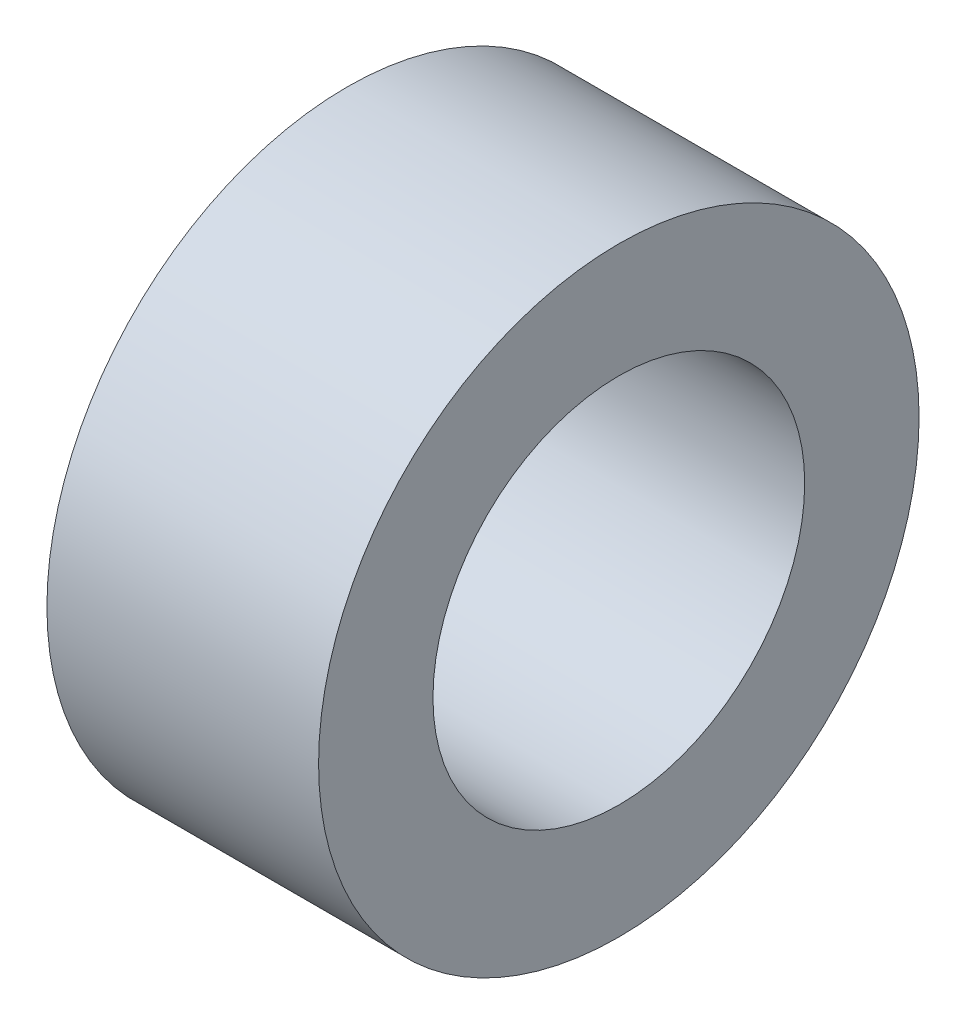
ISO-10303-21;
HEADER;
FILE_DESCRIPTION(('STEP AP214'),'2;1');
FILE_NAME('part.step','',(''),(''),'','','');
FILE_SCHEMA(('AUTOMOTIVE_DESIGN { 1 0 10303 214 1 1 1 1 }'));
ENDSEC;
DATA;
#1=APPLICATION_CONTEXT('core data for automotive mechanical design processes');
#2=APPLICATION_PROTOCOL_DEFINITION('international standard','automotive_design',2000,#1);
#3=PRODUCT_CONTEXT('',#1,'mechanical');
#4=PRODUCT('Part','Part','',(#3));
#5=PRODUCT_RELATED_PRODUCT_CATEGORY('part','',(#4));
#6=PRODUCT_DEFINITION_FORMATION('','',#4);
#7=PRODUCT_DEFINITION_CONTEXT('part definition',#1,'design');
#8=PRODUCT_DEFINITION('design','',#6,#7);
#9=PRODUCT_DEFINITION_SHAPE('','',#8);
#10=(LENGTH_UNIT() NAMED_UNIT(*) SI_UNIT(.MILLI.,.METRE.));
#11=(NAMED_UNIT(*) PLANE_ANGLE_UNIT() SI_UNIT($,.RADIAN.));
#12=(NAMED_UNIT(*) SI_UNIT($,.STERADIAN.) SOLID_ANGLE_UNIT());
#13=UNCERTAINTY_MEASURE_WITH_UNIT(LENGTH_MEASURE(1.E-05),#10,'distance_accuracy_value','');
#14=(GEOMETRIC_REPRESENTATION_CONTEXT(3) GLOBAL_UNCERTAINTY_ASSIGNED_CONTEXT((#13)) GLOBAL_UNIT_ASSIGNED_CONTEXT((#10,
#11,#12)) REPRESENTATION_CONTEXT('',''));
#15=CARTESIAN_POINT('',(0.,0.,0.));
#16=DIRECTION('',(0.,0.,1.));
#17=DIRECTION('',(1.,0.,0.));
#18=AXIS2_PLACEMENT_3D('',#15,#16,#17);
#19=CARTESIAN_POINT('',(0.,0.,0.));
#20=DIRECTION('',(-1.,0.,0.));
#21=DIRECTION('',(0.,0.,1.));
#22=AXIS2_PLACEMENT_3D('',#19,#20,#21);
#23=CYLINDRICAL_SURFACE('',#22,21.);
#24=CARTESIAN_POINT('',(19.,0.,0.));
#25=DIRECTION('',(-1.,0.,0.));
#26=DIRECTION('',(0.,0.,1.));
#27=AXIS2_PLACEMENT_3D('',#24,#25,#26);
#28=CIRCLE('',#27,21.);
#29=CARTESIAN_POINT('',(19.,0.,21.));
#30=VERTEX_POINT('',#29);
#31=EDGE_CURVE('E34',#30,#30,#28,.T.);
#32=ORIENTED_EDGE('',*,*,#31,.T.);
#33=EDGE_LOOP('',(#32));
#34=FACE_BOUND('',#33,.T.);
#35=CARTESIAN_POINT('',(0.,0.,0.));
#36=DIRECTION('',(-1.,0.,0.));
#37=DIRECTION('',(0.,0.,1.));
#38=AXIS2_PLACEMENT_3D('',#35,#36,#37);
#39=CIRCLE('',#38,21.);
#40=CARTESIAN_POINT('',(0.,0.,21.));
#41=VERTEX_POINT('',#40);
#42=EDGE_CURVE('E10',#41,#41,#39,.T.);
#43=ORIENTED_EDGE('',*,*,#42,.F.);
#44=EDGE_LOOP('',(#43));
#45=FACE_BOUND('',#44,.T.);
#46=ADVANCED_FACE('F28',(#34,#45),#23,.T.);
#47=CARTESIAN_POINT('',(0.,0.,21.));
#48=DIRECTION('',(1.,0.,0.));
#49=DIRECTION('',(0.,0.,-1.));
#50=AXIS2_PLACEMENT_3D('',#47,#48,#49);
#51=PLANE('',#50);
#52=CARTESIAN_POINT('',(0.,0.,0.));
#53=DIRECTION('',(-1.,0.,0.));
#54=DIRECTION('',(0.,0.,1.));
#55=AXIS2_PLACEMENT_3D('',#52,#53,#54);
#56=CIRCLE('',#55,13.);
#57=CARTESIAN_POINT('',(0.,0.,13.));
#58=VERTEX_POINT('',#57);
#59=EDGE_CURVE('E42',#58,#58,#56,.T.);
#60=ORIENTED_EDGE('',*,*,#59,.F.);
#61=EDGE_LOOP('',(#60));
#62=FACE_BOUND('',#61,.T.);
#63=ORIENTED_EDGE('',*,*,#42,.T.);
#64=EDGE_LOOP('',(#63));
#65=FACE_BOUND('',#64,.T.);
#66=ADVANCED_FACE('F50',(#62,#65),#51,.F.);
#67=CARTESIAN_POINT('',(19.,0.,0.));
#68=DIRECTION('',(-1.,0.,0.));
#69=DIRECTION('',(0.,0.,1.));
#70=AXIS2_PLACEMENT_3D('',#67,#68,#69);
#71=PLANE('',#70);
#72=CARTESIAN_POINT('',(19.,0.,0.));
#73=DIRECTION('',(-1.,0.,0.));
#74=DIRECTION('',(0.,0.,1.));
#75=AXIS2_PLACEMENT_3D('',#72,#73,#74);
#76=CIRCLE('',#75,13.);
#77=CARTESIAN_POINT('',(19.,0.,13.));
#78=VERTEX_POINT('',#77);
#79=EDGE_CURVE('E38',#78,#78,#76,.T.);
#80=ORIENTED_EDGE('',*,*,#79,.T.);
#81=EDGE_LOOP('',(#80));
#82=FACE_BOUND('',#81,.T.);
#83=ORIENTED_EDGE('',*,*,#31,.F.);
#84=EDGE_LOOP('',(#83));
#85=FACE_BOUND('',#84,.T.);
#86=ADVANCED_FACE('F52',(#82,#85),#71,.F.);
#87=CARTESIAN_POINT('',(19.,0.,0.));
#88=DIRECTION('',(-1.,0.,0.));
#89=DIRECTION('',(0.,0.,1.));
#90=AXIS2_PLACEMENT_3D('',#87,#88,#89);
#91=CYLINDRICAL_SURFACE('',#90,13.);
#92=ORIENTED_EDGE('',*,*,#79,.F.);
#93=EDGE_LOOP('',(#92));
#94=FACE_BOUND('',#93,.T.);
#95=ORIENTED_EDGE('',*,*,#59,.T.);
#96=EDGE_LOOP('',(#95));
#97=FACE_BOUND('',#96,.T.);
#98=ADVANCED_FACE('F48',(#94,#97),#91,.F.);
#99=CLOSED_SHELL('',(#46,#66,#86,#98));
#100=MANIFOLD_SOLID_BREP('B2',#99);
#101=ADVANCED_BREP_SHAPE_REPRESENTATION('',(#18,#100),#14);
#102=SHAPE_DEFINITION_REPRESENTATION(#9,#101);
ENDSEC;
END-ISO-10303-21;
